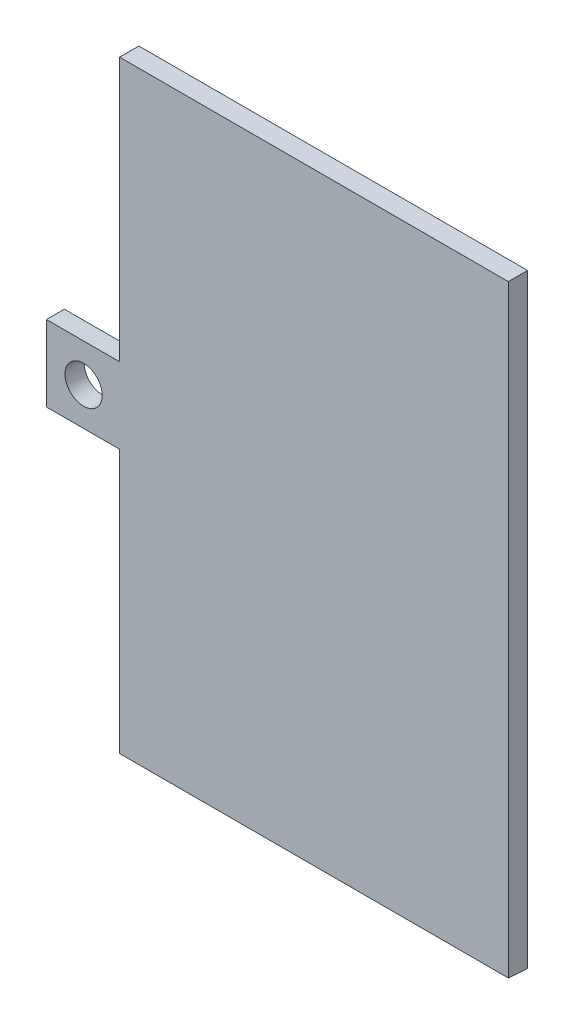
ISO-10303-21;
HEADER;
FILE_DESCRIPTION(('STEP AP214'),'2;1');
FILE_NAME('part.step','',(''),(''),'','','');
FILE_SCHEMA(('AUTOMOTIVE_DESIGN { 1 0 10303 214 1 1 1 1 }'));
ENDSEC;
DATA;
#1=APPLICATION_CONTEXT('core data for automotive mechanical design processes');
#2=APPLICATION_PROTOCOL_DEFINITION('international standard','automotive_design',2000,#1);
#3=PRODUCT_CONTEXT('',#1,'mechanical');
#4=PRODUCT('Part','Part','',(#3));
#5=PRODUCT_RELATED_PRODUCT_CATEGORY('part','',(#4));
#6=PRODUCT_DEFINITION_FORMATION('','',#4);
#7=PRODUCT_DEFINITION_CONTEXT('part definition',#1,'design');
#8=PRODUCT_DEFINITION('design','',#6,#7);
#9=PRODUCT_DEFINITION_SHAPE('','',#8);
#10=(LENGTH_UNIT() NAMED_UNIT(*) SI_UNIT(.MILLI.,.METRE.));
#11=(NAMED_UNIT(*) PLANE_ANGLE_UNIT() SI_UNIT($,.RADIAN.));
#12=(NAMED_UNIT(*) SI_UNIT($,.STERADIAN.) SOLID_ANGLE_UNIT());
#13=UNCERTAINTY_MEASURE_WITH_UNIT(LENGTH_MEASURE(1.E-05),#10,'distance_accuracy_value','');
#14=(GEOMETRIC_REPRESENTATION_CONTEXT(3) GLOBAL_UNCERTAINTY_ASSIGNED_CONTEXT((#13)) GLOBAL_UNIT_ASSIGNED_CONTEXT((#10,
#11,#12)) REPRESENTATION_CONTEXT('',''));
#15=CARTESIAN_POINT('',(0.,0.,0.));
#16=DIRECTION('',(0.,0.,1.));
#17=DIRECTION('',(1.,0.,0.));
#18=AXIS2_PLACEMENT_3D('',#15,#16,#17);
#19=CARTESIAN_POINT('',(-123.354707421995,77.6569773179914,0.));
#20=DIRECTION('',(0.,0.999390827019096,0.034899496702501));
#21=DIRECTION('',(0.,-0.034899496702501,0.999390827019096));
#22=AXIS2_PLACEMENT_3D('',#19,#20,#21);
#23=PLANE('',#22);
#24=DIRECTION('',(0.0348782627423747,0.0348782627423747,-0.998782765958718));
#25=VECTOR('',#24,1.);
#26=CARTESIAN_POINT('',(-115.364439367691,77.647245372296,0.278686461869312));
#27=LINE('',#26,#25);
#28=CARTESIAN_POINT('',(-115.424548960979,77.5871357790079,2.));
#29=VERTEX_POINT('',#28);
#30=CARTESIAN_POINT('',(-115.354707421995,77.6569773179914,0.));
#31=VERTEX_POINT('',#30);
#32=EDGE_CURVE('E65',#29,#31,#27,.T.);
#33=ORIENTED_EDGE('',*,*,#32,.F.);
#34=DIRECTION('',(1.,0.,0.));
#35=VECTOR('',#34,1.);
#36=CARTESIAN_POINT('',(0.,77.5871357790079,2.));
#37=LINE('',#36,#35);
#38=CARTESIAN_POINT('',(-73.6594782084509,77.5871357790079,2.));
#39=VERTEX_POINT('',#38);
#40=EDGE_CURVE('E136',#29,#39,#37,.T.);
#41=ORIENTED_EDGE('',*,*,#40,.T.);
#42=DIRECTION('',(0.0348782627423747,0.0348782627423747,-0.998782765958718));
#43=VECTOR('',#42,1.);
#44=CARTESIAN_POINT('',(-73.6501755402288,77.5964384472299,1.73360643658725));
#45=LINE('',#44,#43);
#46=CARTESIAN_POINT('',(-73.5896366694674,77.6569773179914,0.));
#47=VERTEX_POINT('',#46);
#48=EDGE_CURVE('E49',#39,#47,#45,.T.);
#49=ORIENTED_EDGE('',*,*,#48,.T.);
#50=DIRECTION('',(1.,0.,0.));
#51=VECTOR('',#50,1.);
#52=CARTESIAN_POINT('',(-123.354707421995,77.6569773179914,0.));
#53=LINE('',#52,#51);
#54=EDGE_CURVE('E144',#31,#47,#53,.T.);
#55=ORIENTED_EDGE('',*,*,#54,.F.);
#56=EDGE_LOOP('',(#33,#41,#49,#55));
#57=FACE_BOUND('',#56,.T.);
#58=ADVANCED_FACE('F40',(#57),#23,.T.);
#59=CARTESIAN_POINT('',(-123.354707421995,77.6569773179914,0.));
#60=DIRECTION('',(-0.999390827019096,0.,0.034899496702501));
#61=DIRECTION('',(0.034899496702501,0.,0.999390827019096));
#62=AXIS2_PLACEMENT_3D('',#59,#60,#61);
#63=PLANE('',#62);
#64=DIRECTION('',(0.,-1.,0.));
#65=VECTOR('',#64,1.);
#66=CARTESIAN_POINT('',(-123.354707421995,77.6569773179914,0.));
#67=LINE('',#66,#65);
#68=CARTESIAN_POINT('',(-123.354707421995,49.1771357790079,0.));
#69=VERTEX_POINT('',#68);
#70=CARTESIAN_POINT('',(-123.354707421995,41.1771357790079,0.));
#71=VERTEX_POINT('',#70);
#72=EDGE_CURVE('E123',#69,#71,#67,.T.);
#73=ORIENTED_EDGE('',*,*,#72,.T.);
#74=DIRECTION('',(-0.0348782627423747,0.0348782627423747,-0.998782765958718));
#75=VECTOR('',#74,1.);
#76=CARTESIAN_POINT('',(-123.320097997349,41.1425263543618,0.991084250140243));
#77=LINE('',#76,#75);
#78=CARTESIAN_POINT('',(-123.284865883012,41.1072942400244,2.));
#79=VERTEX_POINT('',#78);
#80=EDGE_CURVE('E57',#79,#71,#77,.T.);
#81=ORIENTED_EDGE('',*,*,#80,.F.);
#82=DIRECTION('',(0.,1.,0.));
#83=VECTOR('',#82,1.);
#84=CARTESIAN_POINT('',(-123.284865883012,0.,2.));
#85=LINE('',#84,#83);
#86=CARTESIAN_POINT('',(-123.284865883012,49.2469773179914,2.));
#87=VERTEX_POINT('',#86);
#88=EDGE_CURVE('E121',#87,#79,#85,.F.);
#89=ORIENTED_EDGE('',*,*,#88,.F.);
#90=DIRECTION('',(-0.0348782627423747,-0.0348782627423747,-0.998782765958718));
#91=VECTOR('',#90,1.);
#92=CARTESIAN_POINT('',(-123.354707421995,49.1771357790079,0.));
#93=LINE('',#92,#91);
#94=EDGE_CURVE('E150',#87,#69,#93,.T.);
#95=ORIENTED_EDGE('',*,*,#94,.T.);
#96=EDGE_LOOP('',(#73,#81,#89,#95));
#97=FACE_BOUND('',#96,.T.);
#98=ADVANCED_FACE('F42',(#97),#63,.T.);
#99=CARTESIAN_POINT('',(-123.354707421995,12.7269773179914,0.));
#100=DIRECTION('',(0.,-0.999390827019096,0.034899496702501));
#101=DIRECTION('',(0.,-0.0348994967025011,-0.999390827019096));
#102=AXIS2_PLACEMENT_3D('',#99,#100,#101);
#103=PLANE('',#102);
#104=DIRECTION('',(-1.,0.,0.));
#105=VECTOR('',#104,1.);
#106=CARTESIAN_POINT('',(0.,12.7968188569749,2.));
#107=LINE('',#106,#105);
#108=CARTESIAN_POINT('',(-115.424548960979,12.7968188569749,2.));
#109=VERTEX_POINT('',#108);
#110=CARTESIAN_POINT('',(-73.6594782084508,12.7968188569749,2.));
#111=VERTEX_POINT('',#110);
#112=EDGE_CURVE('E131',#109,#111,#107,.F.);
#113=ORIENTED_EDGE('',*,*,#112,.F.);
#114=DIRECTION('',(0.0348782627423747,-0.0348782627423747,-0.998782765958718));
#115=VECTOR('',#114,1.);
#116=CARTESIAN_POINT('',(-115.354707421996,12.7269773179914,0.));
#117=LINE('',#116,#115);
#118=CARTESIAN_POINT('',(-115.354707421996,12.7269773179914,0.));
#119=VERTEX_POINT('',#118);
#120=EDGE_CURVE('E115',#109,#119,#117,.T.);
#121=ORIENTED_EDGE('',*,*,#120,.T.);
#122=DIRECTION('',(1.,0.,0.));
#123=VECTOR('',#122,1.);
#124=CARTESIAN_POINT('',(-123.354707421995,12.7269773179914,0.));
#125=LINE('',#124,#123);
#126=CARTESIAN_POINT('',(-73.5896366694674,12.7269773179914,0.));
#127=VERTEX_POINT('',#126);
#128=EDGE_CURVE('E139',#119,#127,#125,.T.);
#129=ORIENTED_EDGE('',*,*,#128,.T.);
#130=DIRECTION('',(-0.0348782627423747,0.0348782627423747,0.998782765958718));
#131=VECTOR('',#130,1.);
#132=CARTESIAN_POINT('',(-73.6501755402288,12.7875161887529,1.73360643658725));
#133=LINE('',#132,#131);
#134=EDGE_CURVE('E11',#111,#127,#133,.F.);
#135=ORIENTED_EDGE('',*,*,#134,.F.);
#136=EDGE_LOOP('',(#113,#121,#129,#135));
#137=FACE_BOUND('',#136,.T.);
#138=ADVANCED_FACE('F176',(#137),#103,.T.);
#139=CARTESIAN_POINT('',(-73.5896366694674,77.6569773179914,0.));
#140=DIRECTION('',(0.999390827019096,0.,0.034899496702501));
#141=DIRECTION('',(0.034899496702501,0.,-0.999390827019096));
#142=AXIS2_PLACEMENT_3D('',#139,#140,#141);
#143=PLANE('',#142);
#144=DIRECTION('',(0.,-1.,0.));
#145=VECTOR('',#144,1.);
#146=CARTESIAN_POINT('',(-73.5896366694674,77.6569773179914,0.));
#147=LINE('',#146,#145);
#148=EDGE_CURVE('E141',#47,#127,#147,.T.);
#149=ORIENTED_EDGE('',*,*,#148,.F.);
#150=ORIENTED_EDGE('',*,*,#48,.F.);
#151=DIRECTION('',(0.,-1.,0.));
#152=VECTOR('',#151,1.);
#153=CARTESIAN_POINT('',(-73.6594782084508,0.,2.));
#154=LINE('',#153,#152);
#155=EDGE_CURVE('E44',#39,#111,#154,.T.);
#156=ORIENTED_EDGE('',*,*,#155,.T.);
#157=ORIENTED_EDGE('',*,*,#134,.T.);
#158=EDGE_LOOP('',(#149,#150,#156,#157));
#159=FACE_BOUND('',#158,.T.);
#160=ADVANCED_FACE('F182',(#159),#143,.T.);
#161=CARTESIAN_POINT('',(0.,0.,2.));
#162=DIRECTION('',(0.,0.,-1.));
#163=DIRECTION('',(-1.,0.,0.));
#164=AXIS2_PLACEMENT_3D('',#161,#162,#163);
#165=PLANE('',#164);
#166=CARTESIAN_POINT('',(-119.284865883012,45.1771357790079,2.));
#167=DIRECTION('',(0.,0.,1.));
#168=DIRECTION('',(1.,0.,0.));
#169=AXIS2_PLACEMENT_3D('',#166,#167,#168);
#170=CIRCLE('',#169,2.);
#171=CARTESIAN_POINT('',(-117.284865883012,45.1771357790079,2.));
#172=VERTEX_POINT('',#171);
#173=EDGE_CURVE('E146',#172,#172,#170,.T.);
#174=ORIENTED_EDGE('',*,*,#173,.F.);
#175=EDGE_LOOP('',(#174));
#176=FACE_BOUND('',#175,.T.);
#177=DIRECTION('',(-1.,0.,0.));
#178=VECTOR('',#177,1.);
#179=CARTESIAN_POINT('',(-123.354707421996,41.1072942400244,2.));
#180=LINE('',#179,#178);
#181=CARTESIAN_POINT('',(-115.424548960979,41.1072942400244,2.));
#182=VERTEX_POINT('',#181);
#183=EDGE_CURVE('E107',#182,#79,#180,.T.);
#184=ORIENTED_EDGE('',*,*,#183,.F.);
#185=DIRECTION('',(0.,1.,0.));
#186=VECTOR('',#185,1.);
#187=CARTESIAN_POINT('',(-115.424548960979,12.7269773179914,2.));
#188=LINE('',#187,#186);
#189=EDGE_CURVE('E169',#109,#182,#188,.T.);
#190=ORIENTED_EDGE('',*,*,#189,.F.);
#191=ORIENTED_EDGE('',*,*,#112,.T.);
#192=ORIENTED_EDGE('',*,*,#155,.F.);
#193=ORIENTED_EDGE('',*,*,#40,.F.);
#194=DIRECTION('',(0.,1.,0.));
#195=VECTOR('',#194,1.);
#196=CARTESIAN_POINT('',(-115.424548960979,77.6569773179914,2.));
#197=LINE('',#196,#195);
#198=CARTESIAN_POINT('',(-115.424548960979,49.2469773179914,2.));
#199=VERTEX_POINT('',#198);
#200=EDGE_CURVE('E114',#199,#29,#197,.T.);
#201=ORIENTED_EDGE('',*,*,#200,.F.);
#202=DIRECTION('',(1.,0.,0.));
#203=VECTOR('',#202,1.);
#204=CARTESIAN_POINT('',(-123.354707421995,49.2469773179914,2.));
#205=LINE('',#204,#203);
#206=EDGE_CURVE('E130',#87,#199,#205,.T.);
#207=ORIENTED_EDGE('',*,*,#206,.F.);
#208=ORIENTED_EDGE('',*,*,#88,.T.);
#209=EDGE_LOOP('',(#184,#190,#191,#192,#193,#201,#207,#208));
#210=FACE_BOUND('',#209,.T.);
#211=ADVANCED_FACE('F127',(#176,#210),#165,.F.);
#212=CARTESIAN_POINT('',(0.,0.,0.));
#213=DIRECTION('',(0.,0.,-1.));
#214=DIRECTION('',(-1.,0.,0.));
#215=AXIS2_PLACEMENT_3D('',#212,#213,#214);
#216=PLANE('',#215);
#217=DIRECTION('',(0.,-1.,0.));
#218=VECTOR('',#217,1.);
#219=CARTESIAN_POINT('',(-115.354707421996,12.7269773179914,0.));
#220=LINE('',#219,#218);
#221=CARTESIAN_POINT('',(-115.354707421996,41.1771357790079,0.));
#222=VERTEX_POINT('',#221);
#223=EDGE_CURVE('E124',#222,#119,#220,.T.);
#224=ORIENTED_EDGE('',*,*,#223,.F.);
#225=DIRECTION('',(1.,0.,0.));
#226=VECTOR('',#225,1.);
#227=CARTESIAN_POINT('',(-123.354707421996,41.1771357790079,0.));
#228=LINE('',#227,#226);
#229=EDGE_CURVE('E167',#71,#222,#228,.T.);
#230=ORIENTED_EDGE('',*,*,#229,.F.);
#231=ORIENTED_EDGE('',*,*,#72,.F.);
#232=DIRECTION('',(-1.,0.,0.));
#233=VECTOR('',#232,1.);
#234=CARTESIAN_POINT('',(-123.354707421995,49.1771357790079,0.));
#235=LINE('',#234,#233);
#236=CARTESIAN_POINT('',(-115.354707421995,49.1771357790079,0.));
#237=VERTEX_POINT('',#236);
#238=EDGE_CURVE('E156',#237,#69,#235,.T.);
#239=ORIENTED_EDGE('',*,*,#238,.F.);
#240=DIRECTION('',(0.,-1.,0.));
#241=VECTOR('',#240,1.);
#242=CARTESIAN_POINT('',(-115.354707421995,77.6569773179914,0.));
#243=LINE('',#242,#241);
#244=EDGE_CURVE('E159',#31,#237,#243,.T.);
#245=ORIENTED_EDGE('',*,*,#244,.F.);
#246=ORIENTED_EDGE('',*,*,#54,.T.);
#247=ORIENTED_EDGE('',*,*,#148,.T.);
#248=ORIENTED_EDGE('',*,*,#128,.F.);
#249=EDGE_LOOP('',(#224,#230,#231,#239,#245,#246,#247,#248));
#250=FACE_BOUND('',#249,.T.);
#251=CARTESIAN_POINT('',(-119.284865883012,45.1771357790079,0.));
#252=DIRECTION('',(0.,0.,-1.));
#253=DIRECTION('',(-1.,0.,0.));
#254=AXIS2_PLACEMENT_3D('',#251,#252,#253);
#255=CIRCLE('',#254,1.9301584610165);
#256=CARTESIAN_POINT('',(-121.215024344029,45.1771357790079,0.));
#257=VERTEX_POINT('',#256);
#258=EDGE_CURVE('E147',#257,#257,#255,.F.);
#259=ORIENTED_EDGE('',*,*,#258,.T.);
#260=EDGE_LOOP('',(#259));
#261=FACE_BOUND('',#260,.T.);
#262=ADVANCED_FACE('F188',(#250,#261),#216,.T.);
#263=CARTESIAN_POINT('',(-119.284865883012,45.1771357790079,2.));
#264=DIRECTION('',(0.,0.,1.));
#265=DIRECTION('',(1.,0.,0.));
#266=AXIS2_PLACEMENT_3D('',#263,#264,#265);
#267=CONICAL_SURFACE('',#266,2.,0.0349065850398867);
#268=ORIENTED_EDGE('',*,*,#258,.F.);
#269=EDGE_LOOP('',(#268));
#270=FACE_BOUND('',#269,.T.);
#271=ORIENTED_EDGE('',*,*,#173,.T.);
#272=EDGE_LOOP('',(#271));
#273=FACE_BOUND('',#272,.T.);
#274=ADVANCED_FACE('F195',(#270,#273),#267,.F.);
#275=CARTESIAN_POINT('',(-123.354707421995,49.1771357790079,0.));
#276=DIRECTION('',(0.,-0.999390827019096,0.034899496702501));
#277=DIRECTION('',(0.,-0.034899496702501,-0.999390827019096));
#278=AXIS2_PLACEMENT_3D('',#275,#276,#277);
#279=PLANE('',#278);
#280=ORIENTED_EDGE('',*,*,#206,.T.);
#281=DIRECTION('',(0.0348782627423747,-0.0348782627423747,-0.998782765958718));
#282=VECTOR('',#281,1.);
#283=CARTESIAN_POINT('',(-115.389352955904,49.2117813129168,0.992118284137244));
#284=LINE('',#283,#282);
#285=EDGE_CURVE('E153',#199,#237,#284,.T.);
#286=ORIENTED_EDGE('',*,*,#285,.T.);
#287=ORIENTED_EDGE('',*,*,#238,.T.);
#288=ORIENTED_EDGE('',*,*,#94,.F.);
#289=EDGE_LOOP('',(#280,#286,#287,#288));
#290=FACE_BOUND('',#289,.T.);
#291=ADVANCED_FACE('F193',(#290),#279,.F.);
#292=CARTESIAN_POINT('',(-115.354707421995,77.6569773179914,0.));
#293=DIRECTION('',(0.999390827019096,0.,0.034899496702501));
#294=DIRECTION('',(0.034899496702501,0.,-0.999390827019096));
#295=AXIS2_PLACEMENT_3D('',#292,#293,#294);
#296=PLANE('',#295);
#297=ORIENTED_EDGE('',*,*,#200,.T.);
#298=ORIENTED_EDGE('',*,*,#32,.T.);
#299=ORIENTED_EDGE('',*,*,#244,.T.);
#300=ORIENTED_EDGE('',*,*,#285,.F.);
#301=EDGE_LOOP('',(#297,#298,#299,#300));
#302=FACE_BOUND('',#301,.T.);
#303=ADVANCED_FACE('F191',(#302),#296,.F.);
#304=CARTESIAN_POINT('',(-115.354707421996,12.7269773179914,0.));
#305=DIRECTION('',(0.999390827019096,0.,0.034899496702501));
#306=DIRECTION('',(0.034899496702501,0.,-0.999390827019096));
#307=AXIS2_PLACEMENT_3D('',#304,#305,#306);
#308=PLANE('',#307);
#309=ORIENTED_EDGE('',*,*,#189,.T.);
#310=DIRECTION('',(0.0348782627423747,0.0348782627423747,-0.998782765958718));
#311=VECTOR('',#310,1.);
#312=CARTESIAN_POINT('',(-115.364439367691,41.1674038333125,0.278686461869311));
#313=LINE('',#312,#311);
#314=EDGE_CURVE('E109',#182,#222,#313,.T.);
#315=ORIENTED_EDGE('',*,*,#314,.T.);
#316=ORIENTED_EDGE('',*,*,#223,.T.);
#317=ORIENTED_EDGE('',*,*,#120,.F.);
#318=EDGE_LOOP('',(#309,#315,#316,#317));
#319=FACE_BOUND('',#318,.T.);
#320=ADVANCED_FACE('F171',(#319),#308,.F.);
#321=CARTESIAN_POINT('',(-123.354707421996,41.1771357790079,0.));
#322=DIRECTION('',(0.,0.999390827019096,0.034899496702501));
#323=DIRECTION('',(0.,-0.034899496702501,0.999390827019096));
#324=AXIS2_PLACEMENT_3D('',#321,#322,#323);
#325=PLANE('',#324);
#326=ORIENTED_EDGE('',*,*,#183,.T.);
#327=ORIENTED_EDGE('',*,*,#80,.T.);
#328=ORIENTED_EDGE('',*,*,#229,.T.);
#329=ORIENTED_EDGE('',*,*,#314,.F.);
#330=EDGE_LOOP('',(#326,#327,#328,#329));
#331=FACE_BOUND('',#330,.T.);
#332=ADVANCED_FACE('F108',(#331),#325,.F.);
#333=CLOSED_SHELL('',(#58,#98,#138,#160,#211,#262,#274,#291,#303,#320,#332));
#334=MANIFOLD_SOLID_BREP('B2',#333);
#335=ADVANCED_BREP_SHAPE_REPRESENTATION('',(#18,#334),#14);
#336=SHAPE_DEFINITION_REPRESENTATION(#9,#335);
ENDSEC;
END-ISO-10303-21;
